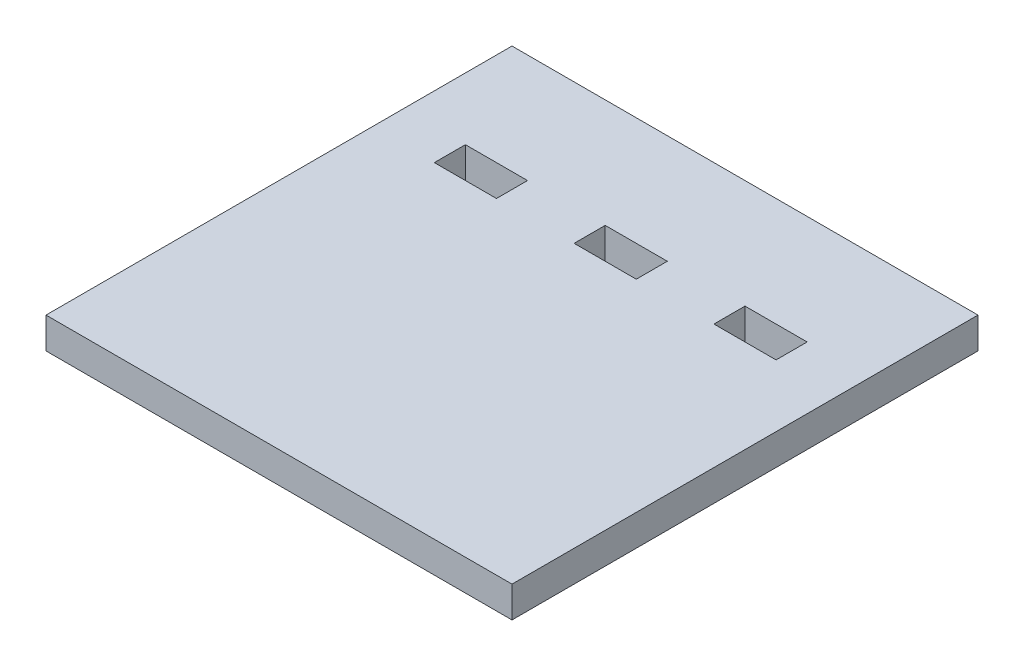
ISO-10303-21;
HEADER;
FILE_DESCRIPTION(('STEP AP214'),'2;1');
FILE_NAME('part.step','',(''),(''),'','','');
FILE_SCHEMA(('AUTOMOTIVE_DESIGN { 1 0 10303 214 1 1 1 1 }'));
ENDSEC;
DATA;
#1=APPLICATION_CONTEXT('core data for automotive mechanical design processes');
#2=APPLICATION_PROTOCOL_DEFINITION('international standard','automotive_design',2000,#1);
#3=PRODUCT_CONTEXT('',#1,'mechanical');
#4=PRODUCT('Part','Part','',(#3));
#5=PRODUCT_RELATED_PRODUCT_CATEGORY('part','',(#4));
#6=PRODUCT_DEFINITION_FORMATION('','',#4);
#7=PRODUCT_DEFINITION_CONTEXT('part definition',#1,'design');
#8=PRODUCT_DEFINITION('design','',#6,#7);
#9=PRODUCT_DEFINITION_SHAPE('','',#8);
#10=(LENGTH_UNIT() NAMED_UNIT(*) SI_UNIT(.MILLI.,.METRE.));
#11=(NAMED_UNIT(*) PLANE_ANGLE_UNIT() SI_UNIT($,.RADIAN.));
#12=(NAMED_UNIT(*) SI_UNIT($,.STERADIAN.) SOLID_ANGLE_UNIT());
#13=UNCERTAINTY_MEASURE_WITH_UNIT(LENGTH_MEASURE(1.E-05),#10,'distance_accuracy_value','');
#14=(GEOMETRIC_REPRESENTATION_CONTEXT(3) GLOBAL_UNCERTAINTY_ASSIGNED_CONTEXT((#13)) GLOBAL_UNIT_ASSIGNED_CONTEXT((#10,
#11,#12)) REPRESENTATION_CONTEXT('',''));
#15=CARTESIAN_POINT('',(0.,0.,0.));
#16=DIRECTION('',(0.,0.,1.));
#17=DIRECTION('',(1.,0.,0.));
#18=AXIS2_PLACEMENT_3D('',#15,#16,#17);
#19=CARTESIAN_POINT('',(0.,10.,0.));
#20=DIRECTION('',(0.,-1.,0.));
#21=DIRECTION('',(0.,0.,-1.));
#22=AXIS2_PLACEMENT_3D('',#19,#20,#21);
#23=PLANE('',#22);
#24=DIRECTION('',(0.,0.,-1.));
#25=VECTOR('',#24,1.);
#26=CARTESIAN_POINT('',(10.,10.,-30.));
#27=LINE('',#26,#25);
#28=CARTESIAN_POINT('',(10.,10.,-30.));
#29=VERTEX_POINT('',#28);
#30=CARTESIAN_POINT('',(10.,10.,-40.));
#31=VERTEX_POINT('',#30);
#32=EDGE_CURVE('E185',#29,#31,#27,.T.);
#33=ORIENTED_EDGE('',*,*,#32,.F.);
#34=DIRECTION('',(1.,0.,0.));
#35=VECTOR('',#34,1.);
#36=CARTESIAN_POINT('',(-10.,10.,-30.));
#37=LINE('',#36,#35);
#38=CARTESIAN_POINT('',(-10.,10.,-30.));
#39=VERTEX_POINT('',#38);
#40=EDGE_CURVE('E193',#39,#29,#37,.T.);
#41=ORIENTED_EDGE('',*,*,#40,.F.);
#42=DIRECTION('',(0.,0.,1.));
#43=VECTOR('',#42,1.);
#44=CARTESIAN_POINT('',(-10.,10.,-30.));
#45=LINE('',#44,#43);
#46=CARTESIAN_POINT('',(-10.,10.,-40.));
#47=VERTEX_POINT('',#46);
#48=EDGE_CURVE('E190',#47,#39,#45,.T.);
#49=ORIENTED_EDGE('',*,*,#48,.F.);
#50=DIRECTION('',(-1.,0.,0.));
#51=VECTOR('',#50,1.);
#52=CARTESIAN_POINT('',(-10.,10.,-40.));
#53=LINE('',#52,#51);
#54=EDGE_CURVE('E187',#31,#47,#53,.T.);
#55=ORIENTED_EDGE('',*,*,#54,.F.);
#56=EDGE_LOOP('',(#33,#41,#49,#55));
#57=FACE_BOUND('',#56,.T.);
#58=DIRECTION('',(0.,0.,-1.));
#59=VECTOR('',#58,1.);
#60=CARTESIAN_POINT('',(75.,10.,75.));
#61=LINE('',#60,#59);
#62=CARTESIAN_POINT('',(75.,10.,75.));
#63=VERTEX_POINT('',#62);
#64=CARTESIAN_POINT('',(75.,10.,-75.));
#65=VERTEX_POINT('',#64);
#66=EDGE_CURVE('E247',#63,#65,#61,.T.);
#67=ORIENTED_EDGE('',*,*,#66,.T.);
#68=DIRECTION('',(-1.,0.,0.));
#69=VECTOR('',#68,1.);
#70=CARTESIAN_POINT('',(-75.,10.,-75.));
#71=LINE('',#70,#69);
#72=CARTESIAN_POINT('',(-75.,10.,-75.));
#73=VERTEX_POINT('',#72);
#74=EDGE_CURVE('E250',#65,#73,#71,.T.);
#75=ORIENTED_EDGE('',*,*,#74,.T.);
#76=DIRECTION('',(0.,0.,1.));
#77=VECTOR('',#76,1.);
#78=CARTESIAN_POINT('',(-75.,10.,75.));
#79=LINE('',#78,#77);
#80=CARTESIAN_POINT('',(-75.,10.,75.));
#81=VERTEX_POINT('',#80);
#82=EDGE_CURVE('E253',#73,#81,#79,.T.);
#83=ORIENTED_EDGE('',*,*,#82,.T.);
#84=DIRECTION('',(1.,0.,0.));
#85=VECTOR('',#84,1.);
#86=CARTESIAN_POINT('',(-75.,10.,75.));
#87=LINE('',#86,#85);
#88=EDGE_CURVE('E255',#81,#63,#87,.T.);
#89=ORIENTED_EDGE('',*,*,#88,.T.);
#90=EDGE_LOOP('',(#67,#75,#83,#89));
#91=FACE_BOUND('',#90,.T.);
#92=DIRECTION('',(0.,0.,-1.));
#93=VECTOR('',#92,1.);
#94=CARTESIAN_POINT('',(-35.,10.,-30.));
#95=LINE('',#94,#93);
#96=CARTESIAN_POINT('',(-35.,10.,-30.));
#97=VERTEX_POINT('',#96);
#98=CARTESIAN_POINT('',(-35.,10.,-40.));
#99=VERTEX_POINT('',#98);
#100=EDGE_CURVE('E216',#97,#99,#95,.T.);
#101=ORIENTED_EDGE('',*,*,#100,.F.);
#102=DIRECTION('',(1.,0.,0.));
#103=VECTOR('',#102,1.);
#104=CARTESIAN_POINT('',(-55.,10.,-30.));
#105=LINE('',#104,#103);
#106=CARTESIAN_POINT('',(-55.,10.,-30.));
#107=VERTEX_POINT('',#106);
#108=EDGE_CURVE('E224',#107,#97,#105,.T.);
#109=ORIENTED_EDGE('',*,*,#108,.F.);
#110=DIRECTION('',(0.,0.,1.));
#111=VECTOR('',#110,1.);
#112=CARTESIAN_POINT('',(-55.,10.,-30.));
#113=LINE('',#112,#111);
#114=CARTESIAN_POINT('',(-55.,10.,-40.));
#115=VERTEX_POINT('',#114);
#116=EDGE_CURVE('E221',#115,#107,#113,.T.);
#117=ORIENTED_EDGE('',*,*,#116,.F.);
#118=DIRECTION('',(-1.,0.,0.));
#119=VECTOR('',#118,1.);
#120=CARTESIAN_POINT('',(-55.,10.,-40.));
#121=LINE('',#120,#119);
#122=EDGE_CURVE('E218',#99,#115,#121,.T.);
#123=ORIENTED_EDGE('',*,*,#122,.F.);
#124=EDGE_LOOP('',(#101,#109,#117,#123));
#125=FACE_BOUND('',#124,.T.);
#126=DIRECTION('',(1.,0.,0.));
#127=VECTOR('',#126,1.);
#128=CARTESIAN_POINT('',(55.,10.,-30.));
#129=LINE('',#128,#127);
#130=CARTESIAN_POINT('',(35.,10.,-30.));
#131=VERTEX_POINT('',#130);
#132=CARTESIAN_POINT('',(55.,10.,-30.));
#133=VERTEX_POINT('',#132);
#134=EDGE_CURVE('E149',#131,#133,#129,.T.);
#135=ORIENTED_EDGE('',*,*,#134,.F.);
#136=DIRECTION('',(0.,0.,1.));
#137=VECTOR('',#136,1.);
#138=CARTESIAN_POINT('',(35.,10.,-30.));
#139=LINE('',#138,#137);
#140=CARTESIAN_POINT('',(35.,10.,-40.));
#141=VERTEX_POINT('',#140);
#142=EDGE_CURVE('E171',#141,#131,#139,.T.);
#143=ORIENTED_EDGE('',*,*,#142,.F.);
#144=DIRECTION('',(-1.,0.,0.));
#145=VECTOR('',#144,1.);
#146=CARTESIAN_POINT('',(55.,10.,-40.));
#147=LINE('',#146,#145);
#148=CARTESIAN_POINT('',(55.,10.,-40.));
#149=VERTEX_POINT('',#148);
#150=EDGE_CURVE('E169',#149,#141,#147,.T.);
#151=ORIENTED_EDGE('',*,*,#150,.F.);
#152=DIRECTION('',(0.,0.,-1.));
#153=VECTOR('',#152,1.);
#154=CARTESIAN_POINT('',(55.,10.,-30.));
#155=LINE('',#154,#153);
#156=EDGE_CURVE('E157',#133,#149,#155,.T.);
#157=ORIENTED_EDGE('',*,*,#156,.F.);
#158=EDGE_LOOP('',(#135,#143,#151,#157));
#159=FACE_BOUND('',#158,.T.);
#160=ADVANCED_FACE('F36',(#57,#91,#125,#159),#23,.F.);
#161=CARTESIAN_POINT('',(0.,0.,0.));
#162=DIRECTION('',(0.,-1.,0.));
#163=DIRECTION('',(0.,0.,-1.));
#164=AXIS2_PLACEMENT_3D('',#161,#162,#163);
#165=PLANE('',#164);
#166=DIRECTION('',(0.,0.,-1.));
#167=VECTOR('',#166,1.);
#168=CARTESIAN_POINT('',(75.,0.,75.));
#169=LINE('',#168,#167);
#170=CARTESIAN_POINT('',(75.,0.,75.));
#171=VERTEX_POINT('',#170);
#172=CARTESIAN_POINT('',(75.,0.,-75.));
#173=VERTEX_POINT('',#172);
#174=EDGE_CURVE('E246',#171,#173,#169,.T.);
#175=ORIENTED_EDGE('',*,*,#174,.F.);
#176=DIRECTION('',(1.,0.,0.));
#177=VECTOR('',#176,1.);
#178=CARTESIAN_POINT('',(-75.,0.,75.));
#179=LINE('',#178,#177);
#180=CARTESIAN_POINT('',(-75.,0.,75.));
#181=VERTEX_POINT('',#180);
#182=EDGE_CURVE('E251',#181,#171,#179,.T.);
#183=ORIENTED_EDGE('',*,*,#182,.F.);
#184=DIRECTION('',(0.,0.,1.));
#185=VECTOR('',#184,1.);
#186=CARTESIAN_POINT('',(-75.,0.,75.));
#187=LINE('',#186,#185);
#188=CARTESIAN_POINT('',(-75.,0.,-75.));
#189=VERTEX_POINT('',#188);
#190=EDGE_CURVE('E262',#189,#181,#187,.T.);
#191=ORIENTED_EDGE('',*,*,#190,.F.);
#192=DIRECTION('',(-1.,0.,0.));
#193=VECTOR('',#192,1.);
#194=CARTESIAN_POINT('',(-75.,0.,-75.));
#195=LINE('',#194,#193);
#196=EDGE_CURVE('E260',#173,#189,#195,.T.);
#197=ORIENTED_EDGE('',*,*,#196,.F.);
#198=EDGE_LOOP('',(#175,#183,#191,#197));
#199=FACE_BOUND('',#198,.T.);
#200=DIRECTION('',(1.,0.,0.));
#201=VECTOR('',#200,1.);
#202=CARTESIAN_POINT('',(-55.,0.,-30.));
#203=LINE('',#202,#201);
#204=CARTESIAN_POINT('',(-55.,0.,-30.));
#205=VERTEX_POINT('',#204);
#206=CARTESIAN_POINT('',(-35.,0.,-30.));
#207=VERTEX_POINT('',#206);
#208=EDGE_CURVE('E219',#205,#207,#203,.T.);
#209=ORIENTED_EDGE('',*,*,#208,.T.);
#210=DIRECTION('',(0.,0.,-1.));
#211=VECTOR('',#210,1.);
#212=CARTESIAN_POINT('',(-35.,0.,-30.));
#213=LINE('',#212,#211);
#214=CARTESIAN_POINT('',(-35.,0.,-40.));
#215=VERTEX_POINT('',#214);
#216=EDGE_CURVE('E215',#207,#215,#213,.T.);
#217=ORIENTED_EDGE('',*,*,#216,.T.);
#218=DIRECTION('',(-1.,0.,0.));
#219=VECTOR('',#218,1.);
#220=CARTESIAN_POINT('',(-55.,0.,-40.));
#221=LINE('',#220,#219);
#222=CARTESIAN_POINT('',(-55.,0.,-40.));
#223=VERTEX_POINT('',#222);
#224=EDGE_CURVE('E229',#215,#223,#221,.T.);
#225=ORIENTED_EDGE('',*,*,#224,.T.);
#226=DIRECTION('',(0.,0.,1.));
#227=VECTOR('',#226,1.);
#228=CARTESIAN_POINT('',(-55.,0.,-30.));
#229=LINE('',#228,#227);
#230=EDGE_CURVE('E232',#223,#205,#229,.T.);
#231=ORIENTED_EDGE('',*,*,#230,.T.);
#232=EDGE_LOOP('',(#209,#217,#225,#231));
#233=FACE_BOUND('',#232,.T.);
#234=DIRECTION('',(1.,0.,0.));
#235=VECTOR('',#234,1.);
#236=CARTESIAN_POINT('',(-10.,0.,-30.));
#237=LINE('',#236,#235);
#238=CARTESIAN_POINT('',(-10.,0.,-30.));
#239=VERTEX_POINT('',#238);
#240=CARTESIAN_POINT('',(10.,0.,-30.));
#241=VERTEX_POINT('',#240);
#242=EDGE_CURVE('E188',#239,#241,#237,.T.);
#243=ORIENTED_EDGE('',*,*,#242,.T.);
#244=DIRECTION('',(0.,0.,-1.));
#245=VECTOR('',#244,1.);
#246=CARTESIAN_POINT('',(10.,0.,-30.));
#247=LINE('',#246,#245);
#248=CARTESIAN_POINT('',(10.,0.,-40.));
#249=VERTEX_POINT('',#248);
#250=EDGE_CURVE('E165',#241,#249,#247,.T.);
#251=ORIENTED_EDGE('',*,*,#250,.T.);
#252=DIRECTION('',(-1.,0.,0.));
#253=VECTOR('',#252,1.);
#254=CARTESIAN_POINT('',(-10.,0.,-40.));
#255=LINE('',#254,#253);
#256=CARTESIAN_POINT('',(-10.,0.,-40.));
#257=VERTEX_POINT('',#256);
#258=EDGE_CURVE('E198',#249,#257,#255,.T.);
#259=ORIENTED_EDGE('',*,*,#258,.T.);
#260=DIRECTION('',(0.,0.,1.));
#261=VECTOR('',#260,1.);
#262=CARTESIAN_POINT('',(-10.,0.,-30.));
#263=LINE('',#262,#261);
#264=EDGE_CURVE('E201',#257,#239,#263,.T.);
#265=ORIENTED_EDGE('',*,*,#264,.T.);
#266=EDGE_LOOP('',(#243,#251,#259,#265));
#267=FACE_BOUND('',#266,.T.);
#268=DIRECTION('',(0.,0.,1.));
#269=VECTOR('',#268,1.);
#270=CARTESIAN_POINT('',(35.,0.,-30.));
#271=LINE('',#270,#269);
#272=CARTESIAN_POINT('',(35.,0.,-40.));
#273=VERTEX_POINT('',#272);
#274=CARTESIAN_POINT('',(35.,0.,-30.));
#275=VERTEX_POINT('',#274);
#276=EDGE_CURVE('E158',#273,#275,#271,.T.);
#277=ORIENTED_EDGE('',*,*,#276,.T.);
#278=DIRECTION('',(1.,0.,0.));
#279=VECTOR('',#278,1.);
#280=CARTESIAN_POINT('',(55.,0.,-30.));
#281=LINE('',#280,#279);
#282=CARTESIAN_POINT('',(55.,0.,-30.));
#283=VERTEX_POINT('',#282);
#284=EDGE_CURVE('E59',#275,#283,#281,.T.);
#285=ORIENTED_EDGE('',*,*,#284,.T.);
#286=DIRECTION('',(0.,0.,-1.));
#287=VECTOR('',#286,1.);
#288=CARTESIAN_POINT('',(55.,0.,-30.));
#289=LINE('',#288,#287);
#290=CARTESIAN_POINT('',(55.,0.,-40.));
#291=VERTEX_POINT('',#290);
#292=EDGE_CURVE('E164',#283,#291,#289,.T.);
#293=ORIENTED_EDGE('',*,*,#292,.T.);
#294=DIRECTION('',(-1.,0.,0.));
#295=VECTOR('',#294,1.);
#296=CARTESIAN_POINT('',(55.,0.,-40.));
#297=LINE('',#296,#295);
#298=EDGE_CURVE('E177',#291,#273,#297,.T.);
#299=ORIENTED_EDGE('',*,*,#298,.T.);
#300=EDGE_LOOP('',(#277,#285,#293,#299));
#301=FACE_BOUND('',#300,.T.);
#302=ADVANCED_FACE('F280',(#199,#233,#267,#301),#165,.T.);
#303=CARTESIAN_POINT('',(75.,10.,75.));
#304=DIRECTION('',(-1.,0.,0.));
#305=DIRECTION('',(0.,0.,1.));
#306=AXIS2_PLACEMENT_3D('',#303,#304,#305);
#307=PLANE('',#306);
#308=ORIENTED_EDGE('',*,*,#174,.T.);
#309=DIRECTION('',(0.,-1.,0.));
#310=VECTOR('',#309,1.);
#311=CARTESIAN_POINT('',(75.,10.,-75.));
#312=LINE('',#311,#310);
#313=EDGE_CURVE('E11',#65,#173,#312,.T.);
#314=ORIENTED_EDGE('',*,*,#313,.F.);
#315=ORIENTED_EDGE('',*,*,#66,.F.);
#316=DIRECTION('',(0.,-1.,0.));
#317=VECTOR('',#316,1.);
#318=CARTESIAN_POINT('',(75.,10.,75.));
#319=LINE('',#318,#317);
#320=EDGE_CURVE('E257',#63,#171,#319,.T.);
#321=ORIENTED_EDGE('',*,*,#320,.T.);
#322=EDGE_LOOP('',(#308,#314,#315,#321));
#323=FACE_BOUND('',#322,.T.);
#324=ADVANCED_FACE('F38',(#323),#307,.F.);
#325=CARTESIAN_POINT('',(-75.,10.,-75.));
#326=DIRECTION('',(0.,0.,1.));
#327=DIRECTION('',(1.,0.,0.));
#328=AXIS2_PLACEMENT_3D('',#325,#326,#327);
#329=PLANE('',#328);
#330=ORIENTED_EDGE('',*,*,#196,.T.);
#331=DIRECTION('',(0.,-1.,0.));
#332=VECTOR('',#331,1.);
#333=CARTESIAN_POINT('',(-75.,10.,-75.));
#334=LINE('',#333,#332);
#335=EDGE_CURVE('E44',#73,#189,#334,.T.);
#336=ORIENTED_EDGE('',*,*,#335,.F.);
#337=ORIENTED_EDGE('',*,*,#74,.F.);
#338=ORIENTED_EDGE('',*,*,#313,.T.);
#339=EDGE_LOOP('',(#330,#336,#337,#338));
#340=FACE_BOUND('',#339,.T.);
#341=ADVANCED_FACE('F291',(#340),#329,.F.);
#342=CARTESIAN_POINT('',(-75.,10.,75.));
#343=DIRECTION('',(1.,0.,0.));
#344=DIRECTION('',(0.,0.,-1.));
#345=AXIS2_PLACEMENT_3D('',#342,#343,#344);
#346=PLANE('',#345);
#347=ORIENTED_EDGE('',*,*,#190,.T.);
#348=DIRECTION('',(0.,-1.,0.));
#349=VECTOR('',#348,1.);
#350=CARTESIAN_POINT('',(-75.,10.,75.));
#351=LINE('',#350,#349);
#352=EDGE_CURVE('E267',#81,#181,#351,.T.);
#353=ORIENTED_EDGE('',*,*,#352,.F.);
#354=ORIENTED_EDGE('',*,*,#82,.F.);
#355=ORIENTED_EDGE('',*,*,#335,.T.);
#356=EDGE_LOOP('',(#347,#353,#354,#355));
#357=FACE_BOUND('',#356,.T.);
#358=ADVANCED_FACE('F274',(#357),#346,.F.);
#359=CARTESIAN_POINT('',(-75.,10.,75.));
#360=DIRECTION('',(0.,0.,-1.));
#361=DIRECTION('',(-1.,0.,0.));
#362=AXIS2_PLACEMENT_3D('',#359,#360,#361);
#363=PLANE('',#362);
#364=ORIENTED_EDGE('',*,*,#182,.T.);
#365=ORIENTED_EDGE('',*,*,#320,.F.);
#366=ORIENTED_EDGE('',*,*,#88,.F.);
#367=ORIENTED_EDGE('',*,*,#352,.T.);
#368=EDGE_LOOP('',(#364,#365,#366,#367));
#369=FACE_BOUND('',#368,.T.);
#370=ADVANCED_FACE('F284',(#369),#363,.F.);
#371=CARTESIAN_POINT('',(-35.,10.,-30.));
#372=DIRECTION('',(-1.,0.,0.));
#373=DIRECTION('',(0.,0.,1.));
#374=AXIS2_PLACEMENT_3D('',#371,#372,#373);
#375=PLANE('',#374);
#376=ORIENTED_EDGE('',*,*,#216,.F.);
#377=DIRECTION('',(0.,-1.,0.));
#378=VECTOR('',#377,1.);
#379=CARTESIAN_POINT('',(-35.,10.,-30.));
#380=LINE('',#379,#378);
#381=EDGE_CURVE('E226',#97,#207,#380,.T.);
#382=ORIENTED_EDGE('',*,*,#381,.F.);
#383=ORIENTED_EDGE('',*,*,#100,.T.);
#384=DIRECTION('',(0.,-1.,0.));
#385=VECTOR('',#384,1.);
#386=CARTESIAN_POINT('',(-35.,10.,-40.));
#387=LINE('',#386,#385);
#388=EDGE_CURVE('E243',#99,#215,#387,.T.);
#389=ORIENTED_EDGE('',*,*,#388,.T.);
#390=EDGE_LOOP('',(#376,#382,#383,#389));
#391=FACE_BOUND('',#390,.T.);
#392=ADVANCED_FACE('F307',(#391),#375,.T.);
#393=CARTESIAN_POINT('',(-55.,10.,-40.));
#394=DIRECTION('',(0.,0.,1.));
#395=DIRECTION('',(1.,0.,0.));
#396=AXIS2_PLACEMENT_3D('',#393,#394,#395);
#397=PLANE('',#396);
#398=ORIENTED_EDGE('',*,*,#224,.F.);
#399=ORIENTED_EDGE('',*,*,#388,.F.);
#400=ORIENTED_EDGE('',*,*,#122,.T.);
#401=DIRECTION('',(0.,-1.,0.));
#402=VECTOR('',#401,1.);
#403=CARTESIAN_POINT('',(-55.,10.,-40.));
#404=LINE('',#403,#402);
#405=EDGE_CURVE('E241',#115,#223,#404,.T.);
#406=ORIENTED_EDGE('',*,*,#405,.T.);
#407=EDGE_LOOP('',(#398,#399,#400,#406));
#408=FACE_BOUND('',#407,.T.);
#409=ADVANCED_FACE('F314',(#408),#397,.T.);
#410=CARTESIAN_POINT('',(-55.,10.,-30.));
#411=DIRECTION('',(1.,0.,0.));
#412=DIRECTION('',(0.,0.,-1.));
#413=AXIS2_PLACEMENT_3D('',#410,#411,#412);
#414=PLANE('',#413);
#415=ORIENTED_EDGE('',*,*,#230,.F.);
#416=ORIENTED_EDGE('',*,*,#405,.F.);
#417=ORIENTED_EDGE('',*,*,#116,.T.);
#418=DIRECTION('',(0.,-1.,0.));
#419=VECTOR('',#418,1.);
#420=CARTESIAN_POINT('',(-55.,10.,-30.));
#421=LINE('',#420,#419);
#422=EDGE_CURVE('E239',#107,#205,#421,.T.);
#423=ORIENTED_EDGE('',*,*,#422,.T.);
#424=EDGE_LOOP('',(#415,#416,#417,#423));
#425=FACE_BOUND('',#424,.T.);
#426=ADVANCED_FACE('F319',(#425),#414,.T.);
#427=CARTESIAN_POINT('',(-55.,10.,-30.));
#428=DIRECTION('',(0.,0.,-1.));
#429=DIRECTION('',(-1.,0.,0.));
#430=AXIS2_PLACEMENT_3D('',#427,#428,#429);
#431=PLANE('',#430);
#432=ORIENTED_EDGE('',*,*,#208,.F.);
#433=ORIENTED_EDGE('',*,*,#422,.F.);
#434=ORIENTED_EDGE('',*,*,#108,.T.);
#435=ORIENTED_EDGE('',*,*,#381,.T.);
#436=EDGE_LOOP('',(#432,#433,#434,#435));
#437=FACE_BOUND('',#436,.T.);
#438=ADVANCED_FACE('F326',(#437),#431,.T.);
#439=CARTESIAN_POINT('',(10.,10.,-30.));
#440=DIRECTION('',(-1.,0.,0.));
#441=DIRECTION('',(0.,0.,1.));
#442=AXIS2_PLACEMENT_3D('',#439,#440,#441);
#443=PLANE('',#442);
#444=ORIENTED_EDGE('',*,*,#250,.F.);
#445=DIRECTION('',(0.,-1.,0.));
#446=VECTOR('',#445,1.);
#447=CARTESIAN_POINT('',(10.,10.,-30.));
#448=LINE('',#447,#446);
#449=EDGE_CURVE('E195',#29,#241,#448,.T.);
#450=ORIENTED_EDGE('',*,*,#449,.F.);
#451=ORIENTED_EDGE('',*,*,#32,.T.);
#452=DIRECTION('',(0.,-1.,0.));
#453=VECTOR('',#452,1.);
#454=CARTESIAN_POINT('',(10.,10.,-40.));
#455=LINE('',#454,#453);
#456=EDGE_CURVE('E212',#31,#249,#455,.T.);
#457=ORIENTED_EDGE('',*,*,#456,.T.);
#458=EDGE_LOOP('',(#444,#450,#451,#457));
#459=FACE_BOUND('',#458,.T.);
#460=ADVANCED_FACE('F339',(#459),#443,.T.);
#461=CARTESIAN_POINT('',(-10.,10.,-40.));
#462=DIRECTION('',(0.,0.,1.));
#463=DIRECTION('',(1.,0.,0.));
#464=AXIS2_PLACEMENT_3D('',#461,#462,#463);
#465=PLANE('',#464);
#466=ORIENTED_EDGE('',*,*,#258,.F.);
#467=ORIENTED_EDGE('',*,*,#456,.F.);
#468=ORIENTED_EDGE('',*,*,#54,.T.);
#469=DIRECTION('',(0.,-1.,0.));
#470=VECTOR('',#469,1.);
#471=CARTESIAN_POINT('',(-10.,10.,-40.));
#472=LINE('',#471,#470);
#473=EDGE_CURVE('E210',#47,#257,#472,.T.);
#474=ORIENTED_EDGE('',*,*,#473,.T.);
#475=EDGE_LOOP('',(#466,#467,#468,#474));
#476=FACE_BOUND('',#475,.T.);
#477=ADVANCED_FACE('F344',(#476),#465,.T.);
#478=CARTESIAN_POINT('',(-10.,10.,-30.));
#479=DIRECTION('',(1.,0.,0.));
#480=DIRECTION('',(0.,0.,-1.));
#481=AXIS2_PLACEMENT_3D('',#478,#479,#480);
#482=PLANE('',#481);
#483=ORIENTED_EDGE('',*,*,#264,.F.);
#484=ORIENTED_EDGE('',*,*,#473,.F.);
#485=ORIENTED_EDGE('',*,*,#48,.T.);
#486=DIRECTION('',(0.,-1.,0.));
#487=VECTOR('',#486,1.);
#488=CARTESIAN_POINT('',(-10.,10.,-30.));
#489=LINE('',#488,#487);
#490=EDGE_CURVE('E208',#39,#239,#489,.T.);
#491=ORIENTED_EDGE('',*,*,#490,.T.);
#492=EDGE_LOOP('',(#483,#484,#485,#491));
#493=FACE_BOUND('',#492,.T.);
#494=ADVANCED_FACE('F348',(#493),#482,.T.);
#495=CARTESIAN_POINT('',(-10.,10.,-30.));
#496=DIRECTION('',(0.,0.,-1.));
#497=DIRECTION('',(-1.,0.,0.));
#498=AXIS2_PLACEMENT_3D('',#495,#496,#497);
#499=PLANE('',#498);
#500=ORIENTED_EDGE('',*,*,#242,.F.);
#501=ORIENTED_EDGE('',*,*,#490,.F.);
#502=ORIENTED_EDGE('',*,*,#40,.T.);
#503=ORIENTED_EDGE('',*,*,#449,.T.);
#504=EDGE_LOOP('',(#500,#501,#502,#503));
#505=FACE_BOUND('',#504,.T.);
#506=ADVANCED_FACE('F352',(#505),#499,.T.);
#507=CARTESIAN_POINT('',(55.,10.,-30.));
#508=DIRECTION('',(0.,0.,-1.));
#509=DIRECTION('',(-1.,0.,0.));
#510=AXIS2_PLACEMENT_3D('',#507,#508,#509);
#511=PLANE('',#510);
#512=ORIENTED_EDGE('',*,*,#284,.F.);
#513=DIRECTION('',(0.,-1.,0.));
#514=VECTOR('',#513,1.);
#515=CARTESIAN_POINT('',(35.,10.,-30.));
#516=LINE('',#515,#514);
#517=EDGE_CURVE('E153',#131,#275,#516,.T.);
#518=ORIENTED_EDGE('',*,*,#517,.F.);
#519=ORIENTED_EDGE('',*,*,#134,.T.);
#520=DIRECTION('',(0.,-1.,0.));
#521=VECTOR('',#520,1.);
#522=CARTESIAN_POINT('',(55.,10.,-30.));
#523=LINE('',#522,#521);
#524=EDGE_CURVE('E152',#133,#283,#523,.T.);
#525=ORIENTED_EDGE('',*,*,#524,.T.);
#526=EDGE_LOOP('',(#512,#518,#519,#525));
#527=FACE_BOUND('',#526,.T.);
#528=ADVANCED_FACE('F151',(#527),#511,.T.);
#529=CARTESIAN_POINT('',(55.,10.,-30.));
#530=DIRECTION('',(-1.,0.,0.));
#531=DIRECTION('',(0.,0.,1.));
#532=AXIS2_PLACEMENT_3D('',#529,#530,#531);
#533=PLANE('',#532);
#534=ORIENTED_EDGE('',*,*,#292,.F.);
#535=ORIENTED_EDGE('',*,*,#524,.F.);
#536=ORIENTED_EDGE('',*,*,#156,.T.);
#537=DIRECTION('',(0.,-1.,0.));
#538=VECTOR('',#537,1.);
#539=CARTESIAN_POINT('',(55.,10.,-40.));
#540=LINE('',#539,#538);
#541=EDGE_CURVE('E166',#149,#291,#540,.T.);
#542=ORIENTED_EDGE('',*,*,#541,.T.);
#543=EDGE_LOOP('',(#534,#535,#536,#542));
#544=FACE_BOUND('',#543,.T.);
#545=ADVANCED_FACE('F161',(#544),#533,.T.);
#546=CARTESIAN_POINT('',(55.,10.,-40.));
#547=DIRECTION('',(0.,0.,1.));
#548=DIRECTION('',(1.,0.,0.));
#549=AXIS2_PLACEMENT_3D('',#546,#547,#548);
#550=PLANE('',#549);
#551=ORIENTED_EDGE('',*,*,#298,.F.);
#552=ORIENTED_EDGE('',*,*,#541,.F.);
#553=ORIENTED_EDGE('',*,*,#150,.T.);
#554=DIRECTION('',(0.,-1.,0.));
#555=VECTOR('',#554,1.);
#556=CARTESIAN_POINT('',(35.,10.,-40.));
#557=LINE('',#556,#555);
#558=EDGE_CURVE('E51',#141,#273,#557,.T.);
#559=ORIENTED_EDGE('',*,*,#558,.T.);
#560=EDGE_LOOP('',(#551,#552,#553,#559));
#561=FACE_BOUND('',#560,.T.);
#562=ADVANCED_FACE('F361',(#561),#550,.T.);
#563=CARTESIAN_POINT('',(35.,10.,-30.));
#564=DIRECTION('',(1.,0.,0.));
#565=DIRECTION('',(0.,0.,-1.));
#566=AXIS2_PLACEMENT_3D('',#563,#564,#565);
#567=PLANE('',#566);
#568=ORIENTED_EDGE('',*,*,#276,.F.);
#569=ORIENTED_EDGE('',*,*,#558,.F.);
#570=ORIENTED_EDGE('',*,*,#142,.T.);
#571=ORIENTED_EDGE('',*,*,#517,.T.);
#572=EDGE_LOOP('',(#568,#569,#570,#571));
#573=FACE_BOUND('',#572,.T.);
#574=ADVANCED_FACE('F364',(#573),#567,.T.);
#575=CLOSED_SHELL('',(#160,#302,#324,#341,#358,#370,#392,#409,#426,#438,#460,#477,#494,#506,
#528,#545,#562,#574));
#576=MANIFOLD_SOLID_BREP('B2',#575);
#577=ADVANCED_BREP_SHAPE_REPRESENTATION('',(#18,#576),#14);
#578=SHAPE_DEFINITION_REPRESENTATION(#9,#577);
ENDSEC;
END-ISO-10303-21;
